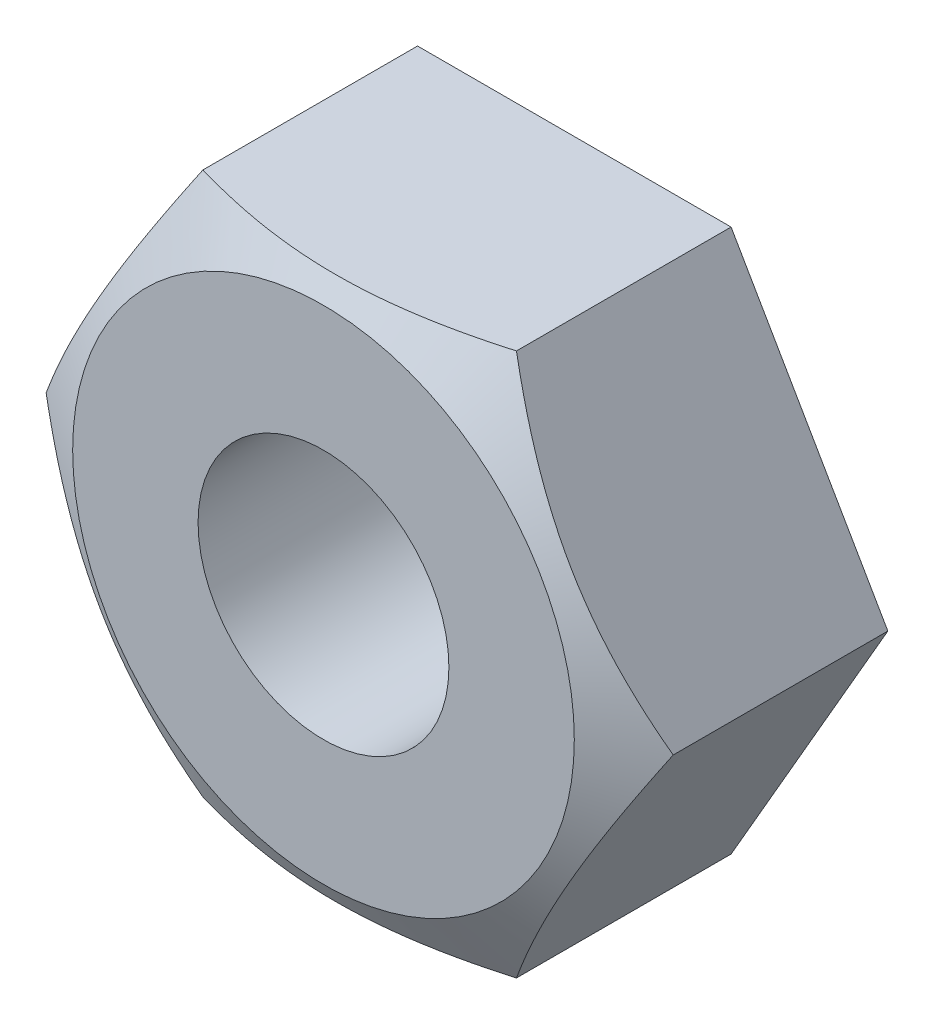
ISO-10303-21;
HEADER;
FILE_DESCRIPTION(('STEP AP214'),'2;1');
FILE_NAME('part.step','',(''),(''),'','','');
FILE_SCHEMA(('AUTOMOTIVE_DESIGN { 1 0 10303 214 1 1 1 1 }'));
ENDSEC;
DATA;
#1=APPLICATION_CONTEXT('core data for automotive mechanical design processes');
#2=APPLICATION_PROTOCOL_DEFINITION('international standard','automotive_design',2000,#1);
#3=PRODUCT_CONTEXT('',#1,'mechanical');
#4=PRODUCT('Part','Part','',(#3));
#5=PRODUCT_RELATED_PRODUCT_CATEGORY('part','',(#4));
#6=PRODUCT_DEFINITION_FORMATION('','',#4);
#7=PRODUCT_DEFINITION_CONTEXT('part definition',#1,'design');
#8=PRODUCT_DEFINITION('design','',#6,#7);
#9=PRODUCT_DEFINITION_SHAPE('','',#8);
#10=(LENGTH_UNIT() NAMED_UNIT(*) SI_UNIT(.MILLI.,.METRE.));
#11=(NAMED_UNIT(*) PLANE_ANGLE_UNIT() SI_UNIT($,.RADIAN.));
#12=(NAMED_UNIT(*) SI_UNIT($,.STERADIAN.) SOLID_ANGLE_UNIT());
#13=UNCERTAINTY_MEASURE_WITH_UNIT(LENGTH_MEASURE(1.E-05),#10,'distance_accuracy_value','');
#14=(GEOMETRIC_REPRESENTATION_CONTEXT(3) GLOBAL_UNCERTAINTY_ASSIGNED_CONTEXT((#13)) GLOBAL_UNIT_ASSIGNED_CONTEXT((#10,
#11,#12)) REPRESENTATION_CONTEXT('',''));
#15=CARTESIAN_POINT('',(0.,0.,0.));
#16=DIRECTION('',(0.,0.,1.));
#17=DIRECTION('',(1.,0.,0.));
#18=AXIS2_PLACEMENT_3D('',#15,#16,#17);
#19=CARTESIAN_POINT('',(0.,0.,0.));
#20=DIRECTION('',(0.,0.,-1.));
#21=DIRECTION('',(1.,0.,0.));
#22=AXIS2_PLACEMENT_3D('',#19,#20,#21);
#23=PLANE('',#22);
#24=CARTESIAN_POINT('',(0.,0.,0.));
#25=DIRECTION('',(0.,0.,1.));
#26=DIRECTION('',(1.,0.,0.));
#27=AXIS2_PLACEMENT_3D('',#24,#25,#26);
#28=CIRCLE('',#27,2.);
#29=CARTESIAN_POINT('',(2.,0.,0.));
#30=VERTEX_POINT('',#29);
#31=EDGE_CURVE('E161',#30,#30,#28,.T.);
#32=ORIENTED_EDGE('',*,*,#31,.F.);
#33=EDGE_LOOP('',(#32));
#34=FACE_BOUND('',#33,.T.);
#35=CARTESIAN_POINT('',(0.,0.,0.));
#36=DIRECTION('',(0.,0.,-1.));
#37=DIRECTION('',(-1.,0.,0.));
#38=AXIS2_PLACEMENT_3D('',#35,#36,#37);
#39=CIRCLE('',#38,4.);
#40=CARTESIAN_POINT('',(-4.,0.,0.));
#41=VERTEX_POINT('',#40);
#42=EDGE_CURVE('E110',#41,#41,#39,.T.);
#43=ORIENTED_EDGE('',*,*,#42,.F.);
#44=EDGE_LOOP('',(#43));
#45=FACE_BOUND('',#44,.T.);
#46=ADVANCED_FACE('F35',(#34,#45),#23,.F.);
#47=CARTESIAN_POINT('',(2.50000000000005,-4.33012701892216,-4.));
#48=DIRECTION('',(-0.866025403784442,0.499999999999995,0.));
#49=DIRECTION('',(-0.499999999999995,-0.866025403784442,0.));
#50=AXIS2_PLACEMENT_3D('',#47,#48,#49);
#51=PLANE('',#50);
#52=CARTESIAN_POINT('',(5.00011547005384,0.000200000000000209,-0.577416938165637));
#53=CARTESIAN_POINT('',(4.89025366193521,-0.190086233472843,-0.513965456572374));
#54=CARTESIAN_POINT('',(4.77944353254965,-0.382015007561932,-0.456258818576725));
#55=CARTESIAN_POINT('',(4.55590451166329,-0.769195949211303,-0.355531695704584));
#56=CARTESIAN_POINT('',(4.44317164842298,-0.96445499602623,-0.312546843697142));
#57=CARTESIAN_POINT('',(4.21910302231792,-1.35255324082236,-0.245635196410057));
#58=CARTESIAN_POINT('',(4.10780173356077,-1.54533272789764,-0.221263059634955));
#59=CARTESIAN_POINT('',(3.88467549089559,-1.93179871669569,-0.19216871595543));
#60=CARTESIAN_POINT('',(3.7728513478988,-2.12548381387898,-0.187422415447268));
#61=CARTESIAN_POINT('',(3.56390471326909,-2.48739000112817,-0.197300541931336));
#62=CARTESIAN_POINT('',(3.4667509305997,-2.65566528885906,-0.209499555088048));
#63=CARTESIAN_POINT('',(3.27307631635828,-2.99111956086151,-0.24816196853798));
#64=CARTESIAN_POINT('',(3.17655615458396,-3.1582973850094,-0.274638573814718));
#65=CARTESIAN_POINT('',(2.98248227505805,-3.49444320477028,-0.340827528264019));
#66=CARTESIAN_POINT('',(2.88495311832942,-3.66336865944361,-0.380820428319264));
#67=CARTESIAN_POINT('',(2.69134936416288,-3.99870019819614,-0.471588388661271));
#68=CARTESIAN_POINT('',(2.59527228669906,-4.16511057780621,-0.522342123928826));
#69=CARTESIAN_POINT('',(2.49988452994621,-4.33032701892216,-0.577416938165637));
#70=B_SPLINE_CURVE_WITH_KNOTS('',3,(#52,#53,#54,#55,#56,#57,#58,#59,#60,#61,#62,#63,#64,#65,#66,
#67,#68,#69),.UNSPECIFIED.,.F.,.F.,(4,2,2,2,2,2,2,2,4),(0.,0.686375611076472,1.37440098738211,
2.04539832488976,2.71557166935567,3.29908680780406,3.88314255256257,4.48015300784622,
5.07599122973501),.UNSPECIFIED.);
#71=CARTESIAN_POINT('',(5.,0.,-0.577350269189623));
#72=VERTEX_POINT('',#71);
#73=CARTESIAN_POINT('',(2.50000000000005,-4.33012701892216,-0.577350269189623));
#74=VERTEX_POINT('',#73);
#75=EDGE_CURVE('E155',#72,#74,#70,.T.);
#76=ORIENTED_EDGE('',*,*,#75,.T.);
#77=DIRECTION('',(0.,0.,1.));
#78=VECTOR('',#77,1.);
#79=CARTESIAN_POINT('',(2.50000000000005,-4.33012701892216,-4.));
#80=LINE('',#79,#78);
#81=CARTESIAN_POINT('',(2.50000000000005,-4.33012701892216,-4.));
#82=VERTEX_POINT('',#81);
#83=EDGE_CURVE('E96',#82,#74,#80,.T.);
#84=ORIENTED_EDGE('',*,*,#83,.F.);
#85=DIRECTION('',(0.499999999999995,0.866025403784442,0.));
#86=VECTOR('',#85,1.);
#87=CARTESIAN_POINT('',(2.50000000000005,-4.33012701892216,-4.));
#88=LINE('',#87,#86);
#89=CARTESIAN_POINT('',(5.,0.,-4.));
#90=VERTEX_POINT('',#89);
#91=EDGE_CURVE('E165',#82,#90,#88,.T.);
#92=ORIENTED_EDGE('',*,*,#91,.T.);
#93=DIRECTION('',(0.,0.,1.));
#94=VECTOR('',#93,1.);
#95=CARTESIAN_POINT('',(5.,0.,-4.));
#96=LINE('',#95,#94);
#97=EDGE_CURVE('E50',#90,#72,#96,.T.);
#98=ORIENTED_EDGE('',*,*,#97,.T.);
#99=EDGE_LOOP('',(#76,#84,#92,#98));
#100=FACE_BOUND('',#99,.T.);
#101=ADVANCED_FACE('F37',(#100),#51,.F.);
#102=CARTESIAN_POINT('',(5.,0.,-4.));
#103=DIRECTION('',(-0.866025403784438,-0.500000000000001,0.));
#104=DIRECTION('',(0.500000000000001,-0.866025403784438,0.));
#105=AXIS2_PLACEMENT_3D('',#102,#103,#104);
#106=PLANE('',#105);
#107=CARTESIAN_POINT('',(2.49988452994615,4.3303270189222,-0.577416938165637));
#108=CARTESIAN_POINT('',(2.60974633806478,4.14004078544936,-0.513965456572374));
#109=CARTESIAN_POINT('',(2.72055646745035,3.94811201136027,-0.456258818576724));
#110=CARTESIAN_POINT('',(2.94409548833671,3.5609310697109,-0.355531695704581));
#111=CARTESIAN_POINT('',(3.05682835157701,3.36567202289597,-0.312546843697138));
#112=CARTESIAN_POINT('',(3.28089697768208,2.97757377809984,-0.245635196410051));
#113=CARTESIAN_POINT('',(3.39219826643923,2.78479429102456,-0.221263059634948));
#114=CARTESIAN_POINT('',(3.61532450910442,2.39832830222652,-0.192168715955422));
#115=CARTESIAN_POINT('',(3.72714865210121,2.20464320504323,-0.187422415447258));
#116=CARTESIAN_POINT('',(3.93609528673092,1.84273701779404,-0.197300541931325));
#117=CARTESIAN_POINT('',(4.03324906940032,1.67446173006314,-0.209499555088036));
#118=CARTESIAN_POINT('',(4.22692368364174,1.33900745806069,-0.248161968537968));
#119=CARTESIAN_POINT('',(4.32344384541607,1.17182963391279,-0.274638573814708));
#120=CARTESIAN_POINT('',(4.51751772494198,0.835683814151903,-0.34082752826401));
#121=CARTESIAN_POINT('',(4.61504688167061,0.666758359478569,-0.380820428319257));
#122=CARTESIAN_POINT('',(4.80865063583716,0.331426820726032,-0.471588388661267));
#123=CARTESIAN_POINT('',(4.90472771330099,0.165016441115957,-0.522342123928823));
#124=CARTESIAN_POINT('',(5.00011547005384,-0.000199999999999837,-0.577416938165637));
#125=B_SPLINE_CURVE_WITH_KNOTS('',3,(#107,#108,#109,#110,#111,#112,#113,#114,#115,#116,#117,
#118,#119,#120,#121,#122,#123,#124),.UNSPECIFIED.,.F.,.F.,(4,2,2,2,2,2,2,2,4),(0.,
0.686375611076472,1.37440098738211,2.04539832488976,2.71557166935567,3.29908680780407,
3.8831425525626,4.48015300784626,5.07599122973507),.UNSPECIFIED.);
#126=CARTESIAN_POINT('',(2.49999999999999,4.3301270189222,-0.577350269189623));
#127=VERTEX_POINT('',#126);
#128=EDGE_CURVE('E149',#127,#72,#125,.T.);
#129=ORIENTED_EDGE('',*,*,#128,.T.);
#130=ORIENTED_EDGE('',*,*,#97,.F.);
#131=DIRECTION('',(-0.500000000000001,0.866025403784438,0.));
#132=VECTOR('',#131,1.);
#133=CARTESIAN_POINT('',(5.,0.,-4.));
#134=LINE('',#133,#132);
#135=CARTESIAN_POINT('',(2.49999999999999,4.3301270189222,-4.));
#136=VERTEX_POINT('',#135);
#137=EDGE_CURVE('E170',#90,#136,#134,.T.);
#138=ORIENTED_EDGE('',*,*,#137,.T.);
#139=DIRECTION('',(0.,0.,1.));
#140=VECTOR('',#139,1.);
#141=CARTESIAN_POINT('',(2.49999999999999,4.3301270189222,-4.));
#142=LINE('',#141,#140);
#143=EDGE_CURVE('E186',#136,#127,#142,.T.);
#144=ORIENTED_EDGE('',*,*,#143,.T.);
#145=EDGE_LOOP('',(#129,#130,#138,#144));
#146=FACE_BOUND('',#145,.T.);
#147=ADVANCED_FACE('F141',(#146),#106,.F.);
#148=CARTESIAN_POINT('',(2.49999999999999,4.3301270189222,-4.));
#149=DIRECTION('',(0.,-1.,0.));
#150=DIRECTION('',(1.,0.,0.));
#151=AXIS2_PLACEMENT_3D('',#148,#149,#150);
#152=PLANE('',#151);
#153=CARTESIAN_POINT('',(-6.79086448991285,4.33012701892217,-2.34053944330404));
#154=CARTESIAN_POINT('',(-6.60105728281807,4.33012701892217,-2.24816463738636));
#155=CARTESIAN_POINT('',(-6.41082232034345,4.33012701892217,-2.1566540959668));
#156=CARTESIAN_POINT('',(-6.02926962163486,4.33012701892217,-1.97584627186708));
#157=CARTESIAN_POINT('',(-5.83795172691154,4.33012701892217,-1.88654932400716));
#158=CARTESIAN_POINT('',(-5.45305637966314,4.33012701892217,-1.71022040478323));
#159=CARTESIAN_POINT('',(-5.25947233927842,4.33012701892217,-1.6232027652126));
#160=CARTESIAN_POINT('',(-4.87079036601036,4.33012701892217,-1.45263006238767));
#161=CARTESIAN_POINT('',(-4.67569250306788,4.33012701892217,-1.36907484028217));
#162=CARTESIAN_POINT('',(-4.27716437210641,4.33012701892218,-1.20363710129628));
#163=CARTESIAN_POINT('',(-4.07367249950604,4.33012701892218,-1.12190219519963));
#164=CARTESIAN_POINT('',(-3.6643362752785,4.33012701892218,-0.964437454302641));
#165=CARTESIAN_POINT('',(-3.45849166681593,4.33012701892218,-0.888708282419298));
#166=CARTESIAN_POINT('',(-3.04448359926232,4.33012701892218,-0.74518730749029));
#167=CARTESIAN_POINT('',(-2.83632553755508,4.33012701892218,-0.677380087618323));
#168=CARTESIAN_POINT('',(-2.41702456565478,4.33012701892218,-0.551828454611039));
#169=CARTESIAN_POINT('',(-2.20588259331022,4.33012701892218,-0.494080952528213));
#170=CARTESIAN_POINT('',(-1.78164371731949,4.33012701892218,-0.391671504857872));
#171=CARTESIAN_POINT('',(-1.56856438750967,4.33012701892219,-0.346938077269352));
#172=CARTESIAN_POINT('',(-1.13967905045159,4.33012701892219,-0.273044058286651));
#173=CARTESIAN_POINT('',(-0.923873338526743,4.33012701892219,-0.243881794771041));
#174=CARTESIAN_POINT('',(-0.493462793658723,4.33012701892219,-0.203834641754312));
#175=CARTESIAN_POINT('',(-0.278880944550066,4.33012701892219,-0.192708833254146));
#176=CARTESIAN_POINT('',(0.150464279883146,4.33012701892219,-0.189038677728335));
#177=CARTESIAN_POINT('',(0.365227658928641,4.33012701892219,-0.196494721297389));
#178=CARTESIAN_POINT('',(0.727561506842216,4.33012701892219,-0.224214972917632));
#179=CARTESIAN_POINT('',(0.875510101175253,4.33012701892219,-0.239841967728237));
#180=CARTESIAN_POINT('',(1.17036732056287,4.3301270189222,-0.278982257666969));
#181=CARTESIAN_POINT('',(1.31727581063951,4.3301270189222,-0.30249655787451));
#182=CARTESIAN_POINT('',(1.75621557956954,4.3301270189222,-0.383638807645104));
#183=CARTESIAN_POINT('',(2.04631398961005,4.3301270189222,-0.451853313491727));
#184=CARTESIAN_POINT('',(2.48032177828492,4.3301270189222,-0.570717116692977));
#185=CARTESIAN_POINT('',(2.62646322703677,4.3301270189222,-0.613685136652574));
#186=CARTESIAN_POINT('',(2.91732723777544,4.3301270189222,-0.70422371614428));
#187=CARTESIAN_POINT('',(3.06204978876846,4.3301270189222,-0.751794311306709));
#188=CARTESIAN_POINT('',(3.35012142844173,4.3301270189222,-0.850762971870059));
#189=CARTESIAN_POINT('',(3.49347090083095,4.3301270189222,-0.902159930548643));
#190=CARTESIAN_POINT('',(3.77897071615781,4.3301270189222,-1.00816259105532));
#191=CARTESIAN_POINT('',(3.92112108747012,4.3301270189222,-1.06276821671092));
#192=CARTESIAN_POINT('',(4.3081332215198,4.33012701892221,-1.21564694014069));
#193=CARTESIAN_POINT('',(4.55193567304269,4.33012701892221,-1.31659930080828));
#194=CARTESIAN_POINT('',(5.03700568500892,4.33012701892221,-1.52444207348191));
#195=CARTESIAN_POINT('',(5.27827295187472,4.33012701892221,-1.63133316438226));
#196=CARTESIAN_POINT('',(5.7588657029633,4.33012701892221,-1.8496266064179));
#197=CARTESIAN_POINT('',(5.99819038498988,4.33012701892221,-1.96103071773284));
#198=CARTESIAN_POINT('',(6.47520157520945,4.33012701892221,-2.18725533770425));
#199=CARTESIAN_POINT('',(6.71288815211205,4.33012701892221,-2.30207570198003));
#200=CARTESIAN_POINT('',(7.18734020381872,4.33012701892222,-2.53456763570872));
#201=CARTESIAN_POINT('',(7.42410354798891,4.33012701892222,-2.65224354424082));
#202=CARTESIAN_POINT('',(7.89656769205742,4.33012701892222,-2.8897116107379));
#203=CARTESIAN_POINT('',(8.13226848073121,4.33012701892222,-3.00950379099312));
#204=CARTESIAN_POINT('',(8.83796936608554,4.33012701892222,-3.37134533428618));
#205=CARTESIAN_POINT('',(9.30667721565674,4.33012701892222,-3.61591375207946));
#206=CARTESIAN_POINT('',(10.1913894611182,4.33012701892223,-4.08294240119161));
#207=CARTESIAN_POINT('',(10.6076350441227,4.33012701892223,-4.30494794343047));
#208=CARTESIAN_POINT('',(11.4387552572515,4.33012701892223,-4.75157226752703));
#209=CARTESIAN_POINT('',(11.8536297985535,4.33012701892223,-4.97619121459069));
#210=CARTESIAN_POINT('',(12.6809295988229,4.33012701892223,-5.42659781392529));
#211=CARTESIAN_POINT('',(13.093358399449,4.33012701892224,-5.65237897102167));
#212=CARTESIAN_POINT('',(13.9173614521083,4.33012701892224,-6.10541789993947));
#213=CARTESIAN_POINT('',(14.3289357700218,4.33012701892224,-6.33267555188752));
#214=CARTESIAN_POINT('',(14.7402111062615,4.33012701892224,-6.56046971255131));
#215=B_SPLINE_CURVE_WITH_KNOTS('',3,(#153,#154,#155,#156,#157,#158,#159,#160,#161,#162,#163,
#164,#165,#166,#167,#168,#169,#170,#171,#172,#173,#174,#175,#176,#177,#178,#179,#180,#181,#182,
#183,#184,#185,#186,#187,#188,#189,#190,#191,#192,#193,#194,#195,#196,#197,#198,#199,#200,#201,
#202,#203,#204,#205,#206,#207,#208,#209,#210,#211,#212,#213,#214),.UNSPECIFIED.,.F.,.F.,(4,2,2,
2,2,2,2,2,2,2,2,2,2,2,2,2,2,2,2,2,2,2,2,2,2,2,2,2,2,2,4),(0.,0.633283728443813,1.2666626677551,
1.90336277558144,2.54003364002185,3.19784013097231,3.85571913027781,4.51229572515876,
5.16867035420124,5.82136855467048,6.47399665053797,7.11783332366378,7.761683530495,
8.20778351456297,8.65394036676677,9.54669521627751,10.0036359368483,10.4605801950575,
10.9173927981755,11.37419456112,12.1657063171623,12.9573087429094,13.7492229413654,
14.5411037186546,15.3342742005587,16.1274530417488,17.7134451373151,19.1286818882899,
20.5440085946263,21.9545626627129,23.3650036075106),.UNSPECIFIED.);
#216=CARTESIAN_POINT('',(-2.50000000000002,4.33012701892218,-0.577350269189623));
#217=VERTEX_POINT('',#216);
#218=EDGE_CURVE('E112',#217,#127,#215,.T.);
#219=ORIENTED_EDGE('',*,*,#218,.T.);
#220=ORIENTED_EDGE('',*,*,#143,.F.);
#221=DIRECTION('',(-1.,0.,0.));
#222=VECTOR('',#221,1.);
#223=CARTESIAN_POINT('',(2.49999999999999,4.3301270189222,-4.));
#224=LINE('',#223,#222);
#225=CARTESIAN_POINT('',(-2.50000000000002,4.33012701892218,-4.));
#226=VERTEX_POINT('',#225);
#227=EDGE_CURVE('E173',#136,#226,#224,.T.);
#228=ORIENTED_EDGE('',*,*,#227,.T.);
#229=DIRECTION('',(0.,0.,1.));
#230=VECTOR('',#229,1.);
#231=CARTESIAN_POINT('',(-2.50000000000002,4.33012701892218,-4.));
#232=LINE('',#231,#230);
#233=EDGE_CURVE('E183',#226,#217,#232,.T.);
#234=ORIENTED_EDGE('',*,*,#233,.T.);
#235=EDGE_LOOP('',(#219,#220,#228,#234));
#236=FACE_BOUND('',#235,.T.);
#237=ADVANCED_FACE('F137',(#236),#152,.F.);
#238=CARTESIAN_POINT('',(-2.50000000000002,4.33012701892218,-4.));
#239=DIRECTION('',(0.866025403784441,-0.499999999999995,0.));
#240=DIRECTION('',(0.499999999999995,0.866025403784442,0.));
#241=AXIS2_PLACEMENT_3D('',#238,#239,#240);
#242=PLANE('',#241);
#243=CARTESIAN_POINT('',(-5.00011547005384,-0.000200000000034915,-0.577416938165637));
#244=CARTESIAN_POINT('',(-4.89025366193521,0.190086233472808,-0.513965456572373));
#245=CARTESIAN_POINT('',(-4.77944353254965,0.382015007561897,-0.456258818576723));
#246=CARTESIAN_POINT('',(-4.55590451166329,0.769195949211268,-0.35553169570458));
#247=CARTESIAN_POINT('',(-4.44317164842298,0.964454996026195,-0.312546843697138));
#248=CARTESIAN_POINT('',(-4.21910302231792,1.35255324082233,-0.245635196410051));
#249=CARTESIAN_POINT('',(-4.10780173356077,1.54533272789761,-0.221263059634948));
#250=CARTESIAN_POINT('',(-3.88467549089559,1.93179871669565,-0.192168715955422));
#251=CARTESIAN_POINT('',(-3.7728513478988,2.12548381387894,-0.187422415447258));
#252=CARTESIAN_POINT('',(-3.56390471326909,2.48739000112814,-0.197300541931325));
#253=CARTESIAN_POINT('',(-3.46675093059969,2.65566528885904,-0.209499555088036));
#254=CARTESIAN_POINT('',(-3.27307631635827,2.99111956086149,-0.248161968537968));
#255=CARTESIAN_POINT('',(-3.17655615458395,3.15829738500938,-0.274638573814707));
#256=CARTESIAN_POINT('',(-2.98248227505803,3.49444320477028,-0.34082752826401));
#257=CARTESIAN_POINT('',(-2.8849531183294,3.66336865944361,-0.380820428319257));
#258=CARTESIAN_POINT('',(-2.69134936416286,3.99870019819615,-0.471588388661267));
#259=CARTESIAN_POINT('',(-2.59527228669903,4.16511057780622,-0.522342123928824));
#260=CARTESIAN_POINT('',(-2.49988452994618,4.33032701892218,-0.577416938165637));
#261=B_SPLINE_CURVE_WITH_KNOTS('',3,(#243,#244,#245,#246,#247,#248,#249,#250,#251,#252,#253,
#254,#255,#256,#257,#258,#259,#260),.UNSPECIFIED.,.F.,.F.,(4,2,2,2,2,2,2,2,4),(0.,
0.686375611076472,1.37440098738212,2.04539832488976,2.71557166935567,3.29908680780407,
3.8831425525626,4.48015300784626,5.07599122973507),.UNSPECIFIED.);
#262=CARTESIAN_POINT('',(-5.,0.,-0.577350269189623));
#263=VERTEX_POINT('',#262);
#264=EDGE_CURVE('E109',#263,#217,#261,.T.);
#265=ORIENTED_EDGE('',*,*,#264,.T.);
#266=ORIENTED_EDGE('',*,*,#233,.F.);
#267=DIRECTION('',(-0.499999999999995,-0.866025403784441,0.));
#268=VECTOR('',#267,1.);
#269=CARTESIAN_POINT('',(-2.50000000000002,4.33012701892218,-4.));
#270=LINE('',#269,#268);
#271=CARTESIAN_POINT('',(-5.,0.,-4.));
#272=VERTEX_POINT('',#271);
#273=EDGE_CURVE('E176',#226,#272,#270,.T.);
#274=ORIENTED_EDGE('',*,*,#273,.T.);
#275=DIRECTION('',(0.,0.,1.));
#276=VECTOR('',#275,1.);
#277=CARTESIAN_POINT('',(-5.,0.,-4.));
#278=LINE('',#277,#276);
#279=EDGE_CURVE('E104',#272,#263,#278,.T.);
#280=ORIENTED_EDGE('',*,*,#279,.T.);
#281=EDGE_LOOP('',(#265,#266,#274,#280));
#282=FACE_BOUND('',#281,.T.);
#283=ADVANCED_FACE('F131',(#282),#242,.F.);
#284=CARTESIAN_POINT('',(-5.,0.,-4.));
#285=DIRECTION('',(0.866025403784435,0.500000000000007,0.));
#286=DIRECTION('',(-0.500000000000007,0.866025403784435,0.));
#287=AXIS2_PLACEMENT_3D('',#284,#285,#286);
#288=PLANE('',#287);
#289=CARTESIAN_POINT('',(-2.49988452994612,-4.33032701892222,-0.577416938165637));
#290=CARTESIAN_POINT('',(-2.60974633806475,-4.14004078544937,-0.513965456572374));
#291=CARTESIAN_POINT('',(-2.72055646745032,-3.94811201136029,-0.456258818576724));
#292=CARTESIAN_POINT('',(-2.94409548833668,-3.56093106971092,-0.355531695704581));
#293=CARTESIAN_POINT('',(-3.05682835157699,-3.36567202289599,-0.312546843697138));
#294=CARTESIAN_POINT('',(-3.28089697768206,-2.97757377809987,-0.245635196410052));
#295=CARTESIAN_POINT('',(-3.39219826643921,-2.78479429102459,-0.221263059634949));
#296=CARTESIAN_POINT('',(-3.6153245091044,-2.39832830222655,-0.192168715955422));
#297=CARTESIAN_POINT('',(-3.72714865210119,-2.20464320504326,-0.187422415447258));
#298=CARTESIAN_POINT('',(-3.93609528673091,-1.84273701779407,-0.197300541931325));
#299=CARTESIAN_POINT('',(-4.03324906940031,-1.67446173006317,-0.209499555088037));
#300=CARTESIAN_POINT('',(-4.22692368364173,-1.33900745806072,-0.248161968537968));
#301=CARTESIAN_POINT('',(-4.32344384541606,-1.17182963391282,-0.274638573814707));
#302=CARTESIAN_POINT('',(-4.51751772494198,-0.835683814151934,-0.34082752826401));
#303=CARTESIAN_POINT('',(-4.61504688167061,-0.666758359478602,-0.380820428319257));
#304=CARTESIAN_POINT('',(-4.80865063583716,-0.331426820726066,-0.471588388661267));
#305=CARTESIAN_POINT('',(-4.90472771330099,-0.165016441115991,-0.522342123928824));
#306=CARTESIAN_POINT('',(-5.00011547005384,0.00019999999996542,-0.577416938165637));
#307=B_SPLINE_CURVE_WITH_KNOTS('',3,(#289,#290,#291,#292,#293,#294,#295,#296,#297,#298,#299,
#300,#301,#302,#303,#304,#305,#306),.UNSPECIFIED.,.F.,.F.,(4,2,2,2,2,2,2,2,4),(0.,
0.686375611076471,1.37440098738211,2.04539832488976,2.71557166935567,3.29908680780407,
3.8831425525626,4.48015300784626,5.07599122973507),.UNSPECIFIED.);
#308=CARTESIAN_POINT('',(-2.50000000000024,-4.33012701892222,-0.577350269189434));
#309=VERTEX_POINT('',#308);
#310=EDGE_CURVE('E101',#309,#263,#307,.T.);
#311=ORIENTED_EDGE('',*,*,#310,.T.);
#312=ORIENTED_EDGE('',*,*,#279,.F.);
#313=DIRECTION('',(0.500000000000007,-0.866025403784435,0.));
#314=VECTOR('',#313,1.);
#315=CARTESIAN_POINT('',(-5.,0.,-4.));
#316=LINE('',#315,#314);
#317=CARTESIAN_POINT('',(-2.49999999999996,-4.33012701892222,-4.));
#318=VERTEX_POINT('',#317);
#319=EDGE_CURVE('E103',#272,#318,#316,.T.);
#320=ORIENTED_EDGE('',*,*,#319,.T.);
#321=DIRECTION('',(0.,0.,1.));
#322=VECTOR('',#321,1.);
#323=CARTESIAN_POINT('',(-2.49999999999996,-4.33012701892222,-4.));
#324=LINE('',#323,#322);
#325=EDGE_CURVE('E93',#318,#309,#324,.T.);
#326=ORIENTED_EDGE('',*,*,#325,.T.);
#327=EDGE_LOOP('',(#311,#312,#320,#326));
#328=FACE_BOUND('',#327,.T.);
#329=ADVANCED_FACE('F99',(#328),#288,.F.);
#330=CARTESIAN_POINT('',(-2.49999999999996,-4.33012701892222,-4.));
#331=DIRECTION('',(0.,1.,0.));
#332=DIRECTION('',(-1.,0.,0.));
#333=AXIS2_PLACEMENT_3D('',#330,#331,#332);
#334=PLANE('',#333);
#335=CARTESIAN_POINT('',(-6.79086449204143,-4.33012701892226,-2.34053944434028));
#336=CARTESIAN_POINT('',(-6.60105728487499,-4.33012701892226,-2.24816463837936));
#337=CARTESIAN_POINT('',(-6.41082232232866,-4.33012701892226,-2.15665409691658));
#338=CARTESIAN_POINT('',(-6.02926962347643,-4.33012701892225,-1.97584627273063));
#339=CARTESIAN_POINT('',(-5.83795172868118,-4.33012701892225,-1.8865493248277));
#340=CARTESIAN_POINT('',(-5.45305638128782,-4.33012701892225,-1.71022040551773));
#341=CARTESIAN_POINT('',(-5.25947234083007,-4.33012701892225,-1.62320276590407));
#342=CARTESIAN_POINT('',(-4.87079036741545,-4.33012701892224,-1.4526300629938));
#343=CARTESIAN_POINT('',(-4.67569250439944,-4.33012701892224,-1.36907484084598));
#344=CARTESIAN_POINT('',(-4.27716437328527,-4.33012701892223,-1.20363710177427));
#345=CARTESIAN_POINT('',(-4.07367250060566,-4.33012701892223,-1.1219021956342));
#346=CARTESIAN_POINT('',(-3.66433627621838,-4.33012701892223,-0.964437454652677));
#347=CARTESIAN_POINT('',(-3.4584916676753,-4.33012701892223,-0.888708282728225));
#348=CARTESIAN_POINT('',(-3.04448359995919,-4.33012701892222,-0.745187307720919));
#349=CARTESIAN_POINT('',(-2.83632553816996,-4.33012701892222,-0.677380087811751));
#350=CARTESIAN_POINT('',(-2.41702456610345,-4.33012701892222,-0.551828454736115));
#351=CARTESIAN_POINT('',(-2.20588259367467,-4.33012701892221,-0.494080952622134));
#352=CARTESIAN_POINT('',(-1.78164371747236,-4.33012701892221,-0.3916715048889));
#353=CARTESIAN_POINT('',(-1.56856438753459,-4.33012701892221,-0.346938077271038));
#354=CARTESIAN_POINT('',(-1.1396790502175,-4.3301270189222,-0.273044058248942));
#355=CARTESIAN_POINT('',(-0.923873338161612,-4.3301270189222,-0.243881794723264));
#356=CARTESIAN_POINT('',(-0.493462793033644,-4.3301270189222,-0.203834641709764));
#357=CARTESIAN_POINT('',(-0.278880943796114,-4.33012701892219,-0.192708833222464));
#358=CARTESIAN_POINT('',(0.15046428089289,-4.33012701892219,-0.18903867774492));
#359=CARTESIAN_POINT('',(0.365227660065305,-4.33012701892219,-0.196494721349379));
#360=CARTESIAN_POINT('',(0.72756150813807,-4.33012701892218,-0.224214973041096));
#361=CARTESIAN_POINT('',(0.875510102504816,-4.33012701892218,-0.239841967880018));
#362=CARTESIAN_POINT('',(1.17036732195834,-4.33012701892218,-0.278982257876887));
#363=CARTESIAN_POINT('',(1.31727581206717,-4.33012701892218,-0.302496558114248));
#364=CARTESIAN_POINT('',(1.75621558109203,-4.33012701892217,-0.383638807974924));
#365=CARTESIAN_POINT('',(2.04631399119326,-4.33012701892217,-0.451853313882393));
#366=CARTESIAN_POINT('',(2.48032177995896,-4.33012701892216,-0.570717117173428));
#367=CARTESIAN_POINT('',(2.62646322874175,-4.33012701892216,-0.613685137163165));
#368=CARTESIAN_POINT('',(2.91732723954195,-4.33012701892216,-0.704223716714227));
#369=CARTESIAN_POINT('',(3.06204979056556,-4.33012701892216,-0.751794311905872));
#370=CARTESIAN_POINT('',(3.35012143029978,-4.33012701892216,-0.850762972526604));
#371=CARTESIAN_POINT('',(3.49347090271935,-4.33012701892215,-0.902159931233352));
#372=CARTESIAN_POINT('',(3.77897071810694,-4.33012701892215,-1.00816259179537));
#373=CARTESIAN_POINT('',(3.92112108944961,-4.33012701892215,-1.06276821747816));
#374=CARTESIAN_POINT('',(4.30813322351619,-4.33012701892215,-1.21564694095484));
#375=CARTESIAN_POINT('',(4.55193567502655,-4.33012701892214,-1.31659930163907));
#376=CARTESIAN_POINT('',(5.03700568696933,-4.33012701892214,-1.52444207434106));
#377=CARTESIAN_POINT('',(5.27827295382423,-4.33012701892214,-1.63133316525312));
#378=CARTESIAN_POINT('',(5.75886570489217,-4.33012701892213,-1.84962660730861));
#379=CARTESIAN_POINT('',(5.99819038690901,-4.33012701892213,-1.9610307186317));
#380=CARTESIAN_POINT('',(6.47520157711015,-4.33012701892212,-2.1872553386169));
#381=CARTESIAN_POINT('',(6.71288815400406,-4.33012701892212,-2.30207570289832));
#382=CARTESIAN_POINT('',(7.18734020569359,-4.33012701892212,-2.53456763663623));
#383=CARTESIAN_POINT('',(7.42410354985533,-4.33012701892211,-2.6522435451719));
#384=CARTESIAN_POINT('',(7.89656769390757,-4.33012701892211,-2.88971161167474));
#385=CARTESIAN_POINT('',(8.13226848257353,-4.33012701892211,-3.00950379193217));
#386=CARTESIAN_POINT('',(8.83796936790529,-4.3301270189221,-3.37134533523043));
#387=CARTESIAN_POINT('',(9.30667721746245,-4.33012701892209,-3.6159137530252));
#388=CARTESIAN_POINT('',(10.1913894629104,-4.33012701892208,-4.08294240214426));
#389=CARTESIAN_POINT('',(10.6076350459153,-4.33012701892208,-4.30494794438888));
#390=CARTESIAN_POINT('',(11.4387552590454,-4.33012701892207,-4.75157226849584));
#391=CARTESIAN_POINT('',(11.8536298003483,-4.33012701892207,-4.97619121556413));
#392=CARTESIAN_POINT('',(12.6809296006218,-4.33012701892206,-5.42659781490828));
#393=CARTESIAN_POINT('',(13.0933584012511,-4.33012701892205,-5.6523789720096));
#394=CARTESIAN_POINT('',(13.9173614539172,-4.33012701892205,-6.10541790093677));
#395=CARTESIAN_POINT('',(14.3289357718343,-4.33012701892204,-6.33267555288925));
#396=CARTESIAN_POINT('',(14.7402111080777,-4.33012701892204,-6.56046971355731));
#397=B_SPLINE_CURVE_WITH_KNOTS('',3,(#335,#336,#337,#338,#339,#340,#341,#342,#343,#344,#345,
#346,#347,#348,#349,#350,#351,#352,#353,#354,#355,#356,#357,#358,#359,#360,#361,#362,#363,#364,
#365,#366,#367,#368,#369,#370,#371,#372,#373,#374,#375,#376,#377,#378,#379,#380,#381,#382,#383,
#384,#385,#386,#387,#388,#389,#390,#391,#392,#393,#394,#395,#396),.UNSPECIFIED.,.F.,.F.,(4,2,2,
2,2,2,2,2,2,2,2,2,2,2,2,2,2,2,2,2,2,2,2,2,2,2,2,2,2,2,4),(0.,0.63328372869389,1.26666266825529,
1.90336277633439,2.54003364102753,3.19784013224709,3.85571913182178,4.51229572697105,
5.16867035628162,5.82136855714377,6.4739966534036,7.11783332691202,7.76168353412604,
8.20778351830349,8.65394037061677,9.54669522034693,10.0036359410323,10.4605801993561,
10.9173928025884,11.3741945656472,12.1657063216741,12.9573087474056,13.7492229458454,
14.5411037231185,15.3342742050047,16.1274530461769,17.713445141708,19.128681892692,
20.5440085990373,21.9545626671395,23.365003611953),.UNSPECIFIED.);
#398=EDGE_CURVE('E11',#74,#309,#397,.F.);
#399=ORIENTED_EDGE('',*,*,#398,.T.);
#400=ORIENTED_EDGE('',*,*,#325,.F.);
#401=DIRECTION('',(1.,0.,0.));
#402=VECTOR('',#401,1.);
#403=CARTESIAN_POINT('',(-2.49999999999996,-4.33012701892222,-4.));
#404=LINE('',#403,#402);
#405=EDGE_CURVE('E62',#318,#82,#404,.T.);
#406=ORIENTED_EDGE('',*,*,#405,.T.);
#407=ORIENTED_EDGE('',*,*,#83,.T.);
#408=EDGE_LOOP('',(#399,#400,#406,#407));
#409=FACE_BOUND('',#408,.T.);
#410=ADVANCED_FACE('F92',(#409),#334,.F.);
#411=CARTESIAN_POINT('',(0.,0.,-4.));
#412=DIRECTION('',(0.,0.,-1.));
#413=DIRECTION('',(1.,0.,0.));
#414=AXIS2_PLACEMENT_3D('',#411,#412,#413);
#415=PLANE('',#414);
#416=ORIENTED_EDGE('',*,*,#91,.F.);
#417=ORIENTED_EDGE('',*,*,#405,.F.);
#418=ORIENTED_EDGE('',*,*,#319,.F.);
#419=ORIENTED_EDGE('',*,*,#273,.F.);
#420=ORIENTED_EDGE('',*,*,#227,.F.);
#421=ORIENTED_EDGE('',*,*,#137,.F.);
#422=EDGE_LOOP('',(#416,#417,#418,#419,#420,#421));
#423=FACE_BOUND('',#422,.T.);
#424=CARTESIAN_POINT('',(0.,0.,-4.));
#425=DIRECTION('',(0.,0.,1.));
#426=DIRECTION('',(1.,0.,0.));
#427=AXIS2_PLACEMENT_3D('',#424,#425,#426);
#428=CIRCLE('',#427,2.);
#429=CARTESIAN_POINT('',(2.,0.,-4.));
#430=VERTEX_POINT('',#429);
#431=EDGE_CURVE('E162',#430,#430,#428,.T.);
#432=ORIENTED_EDGE('',*,*,#431,.T.);
#433=EDGE_LOOP('',(#432));
#434=FACE_BOUND('',#433,.T.);
#435=ADVANCED_FACE('F196',(#423,#434),#415,.T.);
#436=CARTESIAN_POINT('',(0.,0.,-4.));
#437=DIRECTION('',(0.,0.,1.));
#438=DIRECTION('',(-1.,0.,0.));
#439=AXIS2_PLACEMENT_3D('',#436,#437,#438);
#440=CYLINDRICAL_SURFACE('',#439,2.);
#441=ORIENTED_EDGE('',*,*,#431,.F.);
#442=EDGE_LOOP('',(#441));
#443=FACE_BOUND('',#442,.T.);
#444=ORIENTED_EDGE('',*,*,#31,.T.);
#445=EDGE_LOOP('',(#444));
#446=FACE_BOUND('',#445,.T.);
#447=ADVANCED_FACE('F199',(#443,#446),#440,.F.);
#448=CARTESIAN_POINT('',(0.,0.,0.));
#449=DIRECTION('',(0.,0.,-1.));
#450=DIRECTION('',(-1.,0.,0.));
#451=AXIS2_PLACEMENT_3D('',#448,#449,#450);
#452=CONICAL_SURFACE('',#451,4.,1.0471975511966);
#453=ORIENTED_EDGE('',*,*,#42,.T.);
#454=EDGE_LOOP('',(#453));
#455=FACE_BOUND('',#454,.T.);
#456=ORIENTED_EDGE('',*,*,#75,.F.);
#457=ORIENTED_EDGE('',*,*,#128,.F.);
#458=ORIENTED_EDGE('',*,*,#218,.F.);
#459=ORIENTED_EDGE('',*,*,#264,.F.);
#460=ORIENTED_EDGE('',*,*,#310,.F.);
#461=ORIENTED_EDGE('',*,*,#398,.F.);
#462=EDGE_LOOP('',(#456,#457,#458,#459,#460,#461));
#463=FACE_BOUND('',#462,.T.);
#464=ADVANCED_FACE('F107',(#455,#463),#452,.T.);
#465=CLOSED_SHELL('',(#46,#101,#147,#237,#283,#329,#410,#435,#447,#464));
#466=MANIFOLD_SOLID_BREP('B2',#465);
#467=ADVANCED_BREP_SHAPE_REPRESENTATION('',(#18,#466),#14);
#468=SHAPE_DEFINITION_REPRESENTATION(#9,#467);
ENDSEC;
END-ISO-10303-21;
